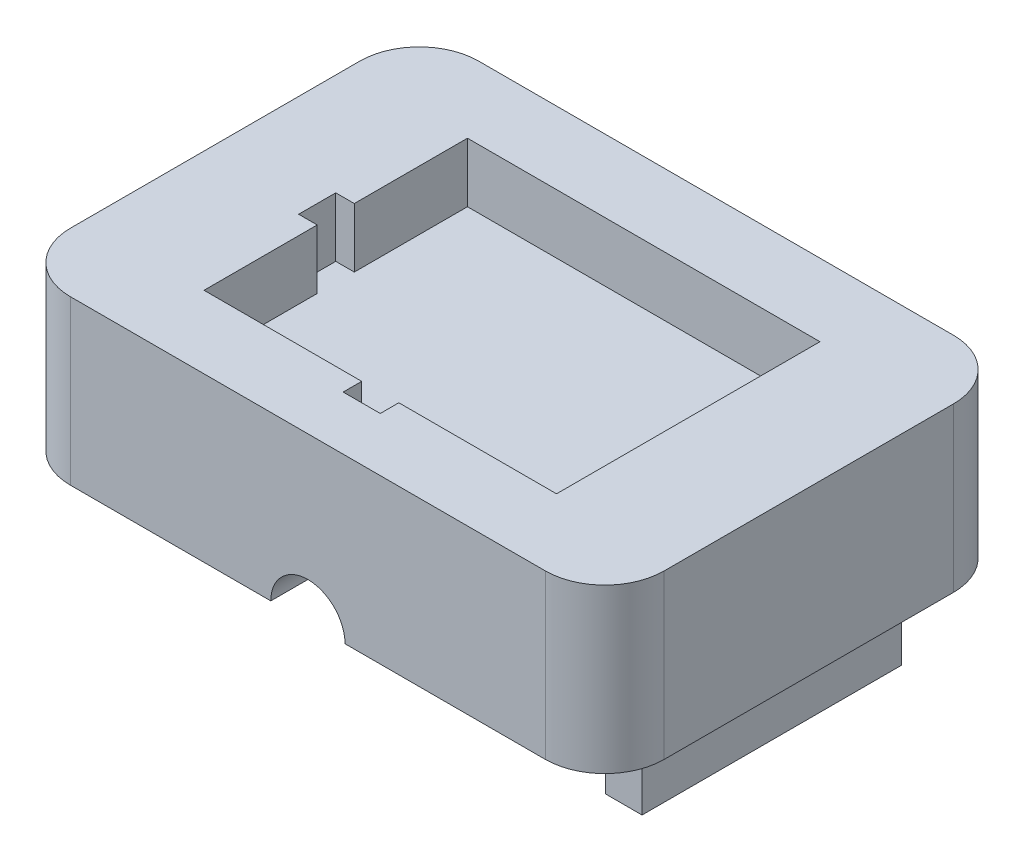
ISO-10303-21;
HEADER;
FILE_DESCRIPTION(('STEP AP214'),'2;1');
FILE_NAME('part.step','',(''),(''),'','','');
FILE_SCHEMA(('AUTOMOTIVE_DESIGN { 1 0 10303 214 1 1 1 1 }'));
ENDSEC;
DATA;
#1=APPLICATION_CONTEXT('core data for automotive mechanical design processes');
#2=APPLICATION_PROTOCOL_DEFINITION('international standard','automotive_design',2000,#1);
#3=PRODUCT_CONTEXT('',#1,'mechanical');
#4=PRODUCT('Part','Part','',(#3));
#5=PRODUCT_RELATED_PRODUCT_CATEGORY('part','',(#4));
#6=PRODUCT_DEFINITION_FORMATION('','',#4);
#7=PRODUCT_DEFINITION_CONTEXT('part definition',#1,'design');
#8=PRODUCT_DEFINITION('design','',#6,#7);
#9=PRODUCT_DEFINITION_SHAPE('','',#8);
#10=(LENGTH_UNIT() NAMED_UNIT(*) SI_UNIT(.MILLI.,.METRE.));
#11=(NAMED_UNIT(*) PLANE_ANGLE_UNIT() SI_UNIT($,.RADIAN.));
#12=(NAMED_UNIT(*) SI_UNIT($,.STERADIAN.) SOLID_ANGLE_UNIT());
#13=UNCERTAINTY_MEASURE_WITH_UNIT(LENGTH_MEASURE(1.E-05),#10,'distance_accuracy_value','');
#14=(GEOMETRIC_REPRESENTATION_CONTEXT(3) GLOBAL_UNCERTAINTY_ASSIGNED_CONTEXT((#13)) GLOBAL_UNIT_ASSIGNED_CONTEXT((#10,
#11,#12)) REPRESENTATION_CONTEXT('',''));
#15=CARTESIAN_POINT('',(0.,0.,0.));
#16=DIRECTION('',(0.,0.,1.));
#17=DIRECTION('',(1.,0.,0.));
#18=AXIS2_PLACEMENT_3D('',#15,#16,#17);
#19=CARTESIAN_POINT('',(0.,0.,55.));
#20=DIRECTION('',(0.,-1.,0.));
#21=DIRECTION('',(1.,0.,0.));
#22=AXIS2_PLACEMENT_3D('',#19,#20,#21);
#23=PLANE('',#22);
#24=DIRECTION('',(-1.,0.,0.));
#25=VECTOR('',#24,1.);
#26=CARTESIAN_POINT('',(0.,0.,0.));
#27=LINE('',#26,#25);
#28=CARTESIAN_POINT('',(32.,0.,0.));
#29=VERTEX_POINT('',#28);
#30=CARTESIAN_POINT('',(5.,0.,0.));
#31=VERTEX_POINT('',#30);
#32=EDGE_CURVE('E530',#29,#31,#27,.T.);
#33=ORIENTED_EDGE('',*,*,#32,.F.);
#34=CARTESIAN_POINT('',(32.,0.,8.));
#35=DIRECTION('',(0.,-1.,0.));
#36=DIRECTION('',(1.,0.,0.));
#37=AXIS2_PLACEMENT_3D('',#34,#35,#36);
#38=CIRCLE('',#37,8.);
#39=CARTESIAN_POINT('',(40.,0.,8.));
#40=VERTEX_POINT('',#39);
#41=EDGE_CURVE('E602',#29,#40,#38,.T.);
#42=ORIENTED_EDGE('',*,*,#41,.T.);
#43=DIRECTION('',(0.,0.,-1.));
#44=VECTOR('',#43,1.);
#45=CARTESIAN_POINT('',(40.,0.,55.));
#46=LINE('',#45,#44);
#47=CARTESIAN_POINT('',(40.,0.,47.));
#48=VERTEX_POINT('',#47);
#49=EDGE_CURVE('E554',#48,#40,#46,.T.);
#50=ORIENTED_EDGE('',*,*,#49,.F.);
#51=CARTESIAN_POINT('',(32.,0.,47.));
#52=DIRECTION('',(0.,-1.,0.));
#53=DIRECTION('',(1.,0.,0.));
#54=AXIS2_PLACEMENT_3D('',#51,#52,#53);
#55=CIRCLE('',#54,8.);
#56=CARTESIAN_POINT('',(32.,0.,55.));
#57=VERTEX_POINT('',#56);
#58=EDGE_CURVE('E599',#48,#57,#55,.T.);
#59=ORIENTED_EDGE('',*,*,#58,.T.);
#60=DIRECTION('',(-1.,0.,0.));
#61=VECTOR('',#60,1.);
#62=CARTESIAN_POINT('',(0.,0.,55.));
#63=LINE('',#62,#61);
#64=CARTESIAN_POINT('',(5.,0.,55.));
#65=VERTEX_POINT('',#64);
#66=EDGE_CURVE('E514',#57,#65,#63,.T.);
#67=ORIENTED_EDGE('',*,*,#66,.T.);
#68=DIRECTION('',(0.,0.,-1.));
#69=VECTOR('',#68,1.);
#70=CARTESIAN_POINT('',(5.,0.,55.));
#71=LINE('',#70,#69);
#72=CARTESIAN_POINT('',(5.,0.,30.525));
#73=VERTEX_POINT('',#72);
#74=EDGE_CURVE('E559',#65,#73,#71,.T.);
#75=ORIENTED_EDGE('',*,*,#74,.T.);
#76=DIRECTION('',(-1.,0.,0.));
#77=VECTOR('',#76,1.);
#78=CARTESIAN_POINT('',(0.,0.,30.525));
#79=LINE('',#78,#77);
#80=CARTESIAN_POINT('',(9.525,0.,30.525));
#81=VERTEX_POINT('',#80);
#82=EDGE_CURVE('E495',#81,#73,#79,.T.);
#83=ORIENTED_EDGE('',*,*,#82,.F.);
#84=DIRECTION('',(0.,0.,1.));
#85=VECTOR('',#84,1.);
#86=CARTESIAN_POINT('',(9.525,0.,24.475));
#87=LINE('',#86,#85);
#88=CARTESIAN_POINT('',(9.525,0.,24.475));
#89=VERTEX_POINT('',#88);
#90=EDGE_CURVE('E506',#89,#81,#87,.T.);
#91=ORIENTED_EDGE('',*,*,#90,.F.);
#92=DIRECTION('',(-1.,0.,0.));
#93=VECTOR('',#92,1.);
#94=CARTESIAN_POINT('',(0.,0.,24.475));
#95=LINE('',#94,#93);
#96=CARTESIAN_POINT('',(5.,0.,24.475));
#97=VERTEX_POINT('',#96);
#98=EDGE_CURVE('E502',#89,#97,#95,.T.);
#99=ORIENTED_EDGE('',*,*,#98,.T.);
#100=EDGE_CURVE('E558',#97,#31,#71,.T.);
#101=ORIENTED_EDGE('',*,*,#100,.T.);
#102=EDGE_LOOP('',(#33,#42,#50,#59,#67,#75,#83,#91,#99,#101));
#103=FACE_BOUND('',#102,.T.);
#104=DIRECTION('',(-1.,0.,0.));
#105=VECTOR('',#104,1.);
#106=CARTESIAN_POINT('',(30.05,0.,44.975));
#107=LINE('',#106,#105);
#108=CARTESIAN_POINT('',(35.,0.,44.975));
#109=VERTEX_POINT('',#108);
#110=CARTESIAN_POINT('',(30.05,0.,44.975));
#111=VERTEX_POINT('',#110);
#112=EDGE_CURVE('E421',#109,#111,#107,.T.);
#113=ORIENTED_EDGE('',*,*,#112,.F.);
#114=DIRECTION('',(0.,0.,1.));
#115=VECTOR('',#114,1.);
#116=CARTESIAN_POINT('',(35.,0.,10.025));
#117=LINE('',#116,#115);
#118=CARTESIAN_POINT('',(35.,0.,10.025));
#119=VERTEX_POINT('',#118);
#120=EDGE_CURVE('E373',#119,#109,#117,.T.);
#121=ORIENTED_EDGE('',*,*,#120,.F.);
#122=DIRECTION('',(1.,0.,0.));
#123=VECTOR('',#122,1.);
#124=CARTESIAN_POINT('',(30.05,0.,10.025));
#125=LINE('',#124,#123);
#126=CARTESIAN_POINT('',(30.05,0.,10.025));
#127=VERTEX_POINT('',#126);
#128=EDGE_CURVE('E408',#127,#119,#125,.T.);
#129=ORIENTED_EDGE('',*,*,#128,.F.);
#130=DIRECTION('',(0.,0.,-1.));
#131=VECTOR('',#130,1.);
#132=CARTESIAN_POINT('',(30.05,0.,10.025));
#133=LINE('',#132,#131);
#134=EDGE_CURVE('E424',#111,#127,#133,.T.);
#135=ORIENTED_EDGE('',*,*,#134,.F.);
#136=EDGE_LOOP('',(#113,#121,#129,#135));
#137=FACE_BOUND('',#136,.T.);
#138=ADVANCED_FACE('F41',(#103,#137),#23,.T.);
#139=CARTESIAN_POINT('',(0.,0.,55.));
#140=DIRECTION('',(0.,-1.,0.));
#141=DIRECTION('',(1.,0.,0.));
#142=AXIS2_PLACEMENT_3D('',#139,#140,#141);
#143=PLANE('',#142);
#144=DIRECTION('',(-1.,0.,0.));
#145=VECTOR('',#144,1.);
#146=CARTESIAN_POINT('',(0.,0.,55.));
#147=LINE('',#146,#145);
#148=CARTESIAN_POINT('',(-5.,0.,55.));
#149=VERTEX_POINT('',#148);
#150=CARTESIAN_POINT('',(-32.,0.,55.));
#151=VERTEX_POINT('',#150);
#152=EDGE_CURVE('E522',#149,#151,#147,.T.);
#153=ORIENTED_EDGE('',*,*,#152,.T.);
#154=CARTESIAN_POINT('',(-32.,0.,47.));
#155=DIRECTION('',(0.,-1.,0.));
#156=DIRECTION('',(1.,0.,0.));
#157=AXIS2_PLACEMENT_3D('',#154,#155,#156);
#158=CIRCLE('',#157,8.);
#159=CARTESIAN_POINT('',(-40.,0.,47.));
#160=VERTEX_POINT('',#159);
#161=EDGE_CURVE('E11',#151,#160,#158,.T.);
#162=ORIENTED_EDGE('',*,*,#161,.T.);
#163=DIRECTION('',(0.,0.,-1.));
#164=VECTOR('',#163,1.);
#165=CARTESIAN_POINT('',(-40.,0.,55.));
#166=LINE('',#165,#164);
#167=CARTESIAN_POINT('',(-40.,0.,8.));
#168=VERTEX_POINT('',#167);
#169=EDGE_CURVE('E544',#160,#168,#166,.T.);
#170=ORIENTED_EDGE('',*,*,#169,.T.);
#171=CARTESIAN_POINT('',(-32.,0.,8.));
#172=DIRECTION('',(0.,-1.,0.));
#173=DIRECTION('',(1.,0.,0.));
#174=AXIS2_PLACEMENT_3D('',#171,#172,#173);
#175=CIRCLE('',#174,8.);
#176=CARTESIAN_POINT('',(-32.,0.,0.));
#177=VERTEX_POINT('',#176);
#178=EDGE_CURVE('E50',#168,#177,#175,.T.);
#179=ORIENTED_EDGE('',*,*,#178,.T.);
#180=DIRECTION('',(-1.,0.,0.));
#181=VECTOR('',#180,1.);
#182=CARTESIAN_POINT('',(0.,0.,0.));
#183=LINE('',#182,#181);
#184=CARTESIAN_POINT('',(-5.,0.,0.));
#185=VERTEX_POINT('',#184);
#186=EDGE_CURVE('E515',#185,#177,#183,.T.);
#187=ORIENTED_EDGE('',*,*,#186,.F.);
#188=DIRECTION('',(0.,0.,-1.));
#189=VECTOR('',#188,1.);
#190=CARTESIAN_POINT('',(-5.,0.,55.));
#191=LINE('',#190,#189);
#192=CARTESIAN_POINT('',(-5.,0.,24.475));
#193=VERTEX_POINT('',#192);
#194=EDGE_CURVE('E526',#193,#185,#191,.T.);
#195=ORIENTED_EDGE('',*,*,#194,.F.);
#196=DIRECTION('',(-1.,0.,0.));
#197=VECTOR('',#196,1.);
#198=CARTESIAN_POINT('',(0.,0.,24.475));
#199=LINE('',#198,#197);
#200=CARTESIAN_POINT('',(-9.525,0.,24.475));
#201=VERTEX_POINT('',#200);
#202=EDGE_CURVE('E569',#193,#201,#199,.T.);
#203=ORIENTED_EDGE('',*,*,#202,.T.);
#204=DIRECTION('',(0.,0.,1.));
#205=VECTOR('',#204,1.);
#206=CARTESIAN_POINT('',(-9.525,0.,24.475));
#207=LINE('',#206,#205);
#208=CARTESIAN_POINT('',(-9.525,0.,30.525));
#209=VERTEX_POINT('',#208);
#210=EDGE_CURVE('E566',#209,#201,#207,.F.);
#211=ORIENTED_EDGE('',*,*,#210,.F.);
#212=DIRECTION('',(-1.,0.,0.));
#213=VECTOR('',#212,1.);
#214=CARTESIAN_POINT('',(0.,0.,30.525));
#215=LINE('',#214,#213);
#216=CARTESIAN_POINT('',(-5.,0.,30.525));
#217=VERTEX_POINT('',#216);
#218=EDGE_CURVE('E563',#217,#209,#215,.T.);
#219=ORIENTED_EDGE('',*,*,#218,.F.);
#220=EDGE_CURVE('E540',#149,#217,#191,.T.);
#221=ORIENTED_EDGE('',*,*,#220,.F.);
#222=EDGE_LOOP('',(#153,#162,#170,#179,#187,#195,#203,#211,#219,#221));
#223=FACE_BOUND('',#222,.T.);
#224=DIRECTION('',(1.,0.,0.));
#225=VECTOR('',#224,1.);
#226=CARTESIAN_POINT('',(-35.,0.,10.025));
#227=LINE('',#226,#225);
#228=CARTESIAN_POINT('',(-35.,0.,10.025));
#229=VERTEX_POINT('',#228);
#230=CARTESIAN_POINT('',(-30.05,0.,10.025));
#231=VERTEX_POINT('',#230);
#232=EDGE_CURVE('E462',#229,#231,#227,.T.);
#233=ORIENTED_EDGE('',*,*,#232,.F.);
#234=DIRECTION('',(0.,0.,-1.));
#235=VECTOR('',#234,1.);
#236=CARTESIAN_POINT('',(-35.,0.,44.975));
#237=LINE('',#236,#235);
#238=CARTESIAN_POINT('',(-35.,0.,44.975));
#239=VERTEX_POINT('',#238);
#240=EDGE_CURVE('E443',#239,#229,#237,.T.);
#241=ORIENTED_EDGE('',*,*,#240,.F.);
#242=DIRECTION('',(-1.,0.,0.));
#243=VECTOR('',#242,1.);
#244=CARTESIAN_POINT('',(-35.,0.,44.975));
#245=LINE('',#244,#243);
#246=CARTESIAN_POINT('',(-30.05,0.,44.975));
#247=VERTEX_POINT('',#246);
#248=EDGE_CURVE('E449',#247,#239,#245,.T.);
#249=ORIENTED_EDGE('',*,*,#248,.F.);
#250=DIRECTION('',(0.,0.,1.));
#251=VECTOR('',#250,1.);
#252=CARTESIAN_POINT('',(-30.05,0.,44.975));
#253=LINE('',#252,#251);
#254=EDGE_CURVE('E465',#231,#247,#253,.T.);
#255=ORIENTED_EDGE('',*,*,#254,.F.);
#256=EDGE_LOOP('',(#233,#241,#249,#255));
#257=FACE_BOUND('',#256,.T.);
#258=ADVANCED_FACE('F621',(#223,#257),#143,.T.);
#259=CARTESIAN_POINT('',(0.,0.,55.));
#260=DIRECTION('',(0.,0.,-1.));
#261=DIRECTION('',(-1.,0.,0.));
#262=AXIS2_PLACEMENT_3D('',#259,#260,#261);
#263=CYLINDRICAL_SURFACE('',#262,5.);
#264=ORIENTED_EDGE('',*,*,#100,.F.);
#265=CARTESIAN_POINT('',(0.,0.,24.475));
#266=DIRECTION('',(0.,0.,1.));
#267=DIRECTION('',(1.,0.,0.));
#268=AXIS2_PLACEMENT_3D('',#265,#266,#267);
#269=CIRCLE('',#268,5.);
#270=EDGE_CURVE('E498',#97,#193,#269,.T.);
#271=ORIENTED_EDGE('',*,*,#270,.T.);
#272=ORIENTED_EDGE('',*,*,#194,.T.);
#273=CARTESIAN_POINT('',(0.,0.,0.));
#274=DIRECTION('',(0.,0.,1.));
#275=DIRECTION('',(1.,0.,0.));
#276=AXIS2_PLACEMENT_3D('',#273,#274,#275);
#277=CIRCLE('',#276,5.);
#278=EDGE_CURVE('E509',#31,#185,#277,.T.);
#279=ORIENTED_EDGE('',*,*,#278,.F.);
#280=EDGE_LOOP('',(#264,#271,#272,#279));
#281=FACE_BOUND('',#280,.T.);
#282=ADVANCED_FACE('F667',(#281),#263,.F.);
#283=CARTESIAN_POINT('',(0.,0.,30.525));
#284=DIRECTION('',(0.,0.,1.));
#285=DIRECTION('',(1.,0.,0.));
#286=AXIS2_PLACEMENT_3D('',#283,#284,#285);
#287=CIRCLE('',#286,5.);
#288=EDGE_CURVE('E489',#73,#217,#287,.T.);
#289=ORIENTED_EDGE('',*,*,#288,.F.);
#290=ORIENTED_EDGE('',*,*,#74,.F.);
#291=CARTESIAN_POINT('',(0.,0.,55.));
#292=DIRECTION('',(0.,0.,1.));
#293=DIRECTION('',(1.,0.,0.));
#294=AXIS2_PLACEMENT_3D('',#291,#292,#293);
#295=CIRCLE('',#294,5.);
#296=EDGE_CURVE('E510',#65,#149,#295,.T.);
#297=ORIENTED_EDGE('',*,*,#296,.T.);
#298=ORIENTED_EDGE('',*,*,#220,.T.);
#299=EDGE_LOOP('',(#289,#290,#297,#298));
#300=FACE_BOUND('',#299,.T.);
#301=ADVANCED_FACE('F683',(#300),#263,.F.);
#302=CARTESIAN_POINT('',(40.,0.,55.));
#303=DIRECTION('',(-1.,0.,0.));
#304=DIRECTION('',(0.,0.,1.));
#305=AXIS2_PLACEMENT_3D('',#302,#303,#304);
#306=PLANE('',#305);
#307=ORIENTED_EDGE('',*,*,#49,.T.);
#308=DIRECTION('',(0.,1.,0.));
#309=VECTOR('',#308,1.);
#310=CARTESIAN_POINT('',(40.,0.,8.));
#311=LINE('',#310,#309);
#312=CARTESIAN_POINT('',(40.,22.,8.));
#313=VERTEX_POINT('',#312);
#314=EDGE_CURVE('E576',#40,#313,#311,.T.);
#315=ORIENTED_EDGE('',*,*,#314,.T.);
#316=DIRECTION('',(0.,0.,-1.));
#317=VECTOR('',#316,1.);
#318=CARTESIAN_POINT('',(40.,22.,55.));
#319=LINE('',#318,#317);
#320=CARTESIAN_POINT('',(40.,22.,47.));
#321=VERTEX_POINT('',#320);
#322=EDGE_CURVE('E550',#321,#313,#319,.T.);
#323=ORIENTED_EDGE('',*,*,#322,.F.);
#324=DIRECTION('',(0.,1.,0.));
#325=VECTOR('',#324,1.);
#326=CARTESIAN_POINT('',(40.,0.,47.));
#327=LINE('',#326,#325);
#328=EDGE_CURVE('E573',#321,#48,#327,.F.);
#329=ORIENTED_EDGE('',*,*,#328,.T.);
#330=EDGE_LOOP('',(#307,#315,#323,#329));
#331=FACE_BOUND('',#330,.T.);
#332=ADVANCED_FACE('F652',(#331),#306,.F.);
#333=CARTESIAN_POINT('',(0.,22.,55.));
#334=DIRECTION('',(0.,-1.,0.));
#335=DIRECTION('',(1.,0.,0.));
#336=AXIS2_PLACEMENT_3D('',#333,#334,#335);
#337=PLANE('',#336);
#338=DIRECTION('',(-1.,0.,0.));
#339=VECTOR('',#338,1.);
#340=CARTESIAN_POINT('',(-23.75,22.,9.75000000000001));
#341=LINE('',#340,#339);
#342=CARTESIAN_POINT('',(23.75,22.,9.75));
#343=VERTEX_POINT('',#342);
#344=CARTESIAN_POINT('',(-23.75,22.,9.75000000000001));
#345=VERTEX_POINT('',#344);
#346=EDGE_CURVE('E332',#343,#345,#341,.T.);
#347=ORIENTED_EDGE('',*,*,#346,.F.);
#348=DIRECTION('',(0.,0.,-1.));
#349=VECTOR('',#348,1.);
#350=CARTESIAN_POINT('',(23.75,22.,45.25));
#351=LINE('',#350,#349);
#352=CARTESIAN_POINT('',(23.75,22.,45.25));
#353=VERTEX_POINT('',#352);
#354=EDGE_CURVE('E57',#353,#343,#351,.T.);
#355=ORIENTED_EDGE('',*,*,#354,.F.);
#356=DIRECTION('',(1.,0.,0.));
#357=VECTOR('',#356,1.);
#358=CARTESIAN_POINT('',(2.5,22.,45.25));
#359=LINE('',#358,#357);
#360=CARTESIAN_POINT('',(2.5,22.,45.25));
#361=VERTEX_POINT('',#360);
#362=EDGE_CURVE('E288',#361,#353,#359,.T.);
#363=ORIENTED_EDGE('',*,*,#362,.F.);
#364=DIRECTION('',(0.,0.,-1.));
#365=VECTOR('',#364,1.);
#366=CARTESIAN_POINT('',(2.5,22.,47.75));
#367=LINE('',#366,#365);
#368=CARTESIAN_POINT('',(2.5,22.,47.75));
#369=VERTEX_POINT('',#368);
#370=EDGE_CURVE('E292',#369,#361,#367,.T.);
#371=ORIENTED_EDGE('',*,*,#370,.F.);
#372=DIRECTION('',(1.,0.,0.));
#373=VECTOR('',#372,1.);
#374=CARTESIAN_POINT('',(-2.5,22.,47.75));
#375=LINE('',#374,#373);
#376=CARTESIAN_POINT('',(-2.5,22.,47.75));
#377=VERTEX_POINT('',#376);
#378=EDGE_CURVE('E363',#377,#369,#375,.T.);
#379=ORIENTED_EDGE('',*,*,#378,.F.);
#380=DIRECTION('',(0.,0.,1.));
#381=VECTOR('',#380,1.);
#382=CARTESIAN_POINT('',(-2.5,22.,45.25));
#383=LINE('',#382,#381);
#384=CARTESIAN_POINT('',(-2.5,22.,45.25));
#385=VERTEX_POINT('',#384);
#386=EDGE_CURVE('E359',#385,#377,#383,.T.);
#387=ORIENTED_EDGE('',*,*,#386,.F.);
#388=DIRECTION('',(1.,0.,0.));
#389=VECTOR('',#388,1.);
#390=CARTESIAN_POINT('',(-23.75,22.,45.25));
#391=LINE('',#390,#389);
#392=CARTESIAN_POINT('',(-23.75,22.,45.25));
#393=VERTEX_POINT('',#392);
#394=EDGE_CURVE('E355',#393,#385,#391,.T.);
#395=ORIENTED_EDGE('',*,*,#394,.F.);
#396=DIRECTION('',(0.,0.,1.));
#397=VECTOR('',#396,1.);
#398=CARTESIAN_POINT('',(-23.75,22.,45.25));
#399=LINE('',#398,#397);
#400=CARTESIAN_POINT('',(-23.75,22.,30.));
#401=VERTEX_POINT('',#400);
#402=EDGE_CURVE('E351',#401,#393,#399,.T.);
#403=ORIENTED_EDGE('',*,*,#402,.F.);
#404=DIRECTION('',(1.,0.,0.));
#405=VECTOR('',#404,1.);
#406=CARTESIAN_POINT('',(-26.25,22.,30.));
#407=LINE('',#406,#405);
#408=CARTESIAN_POINT('',(-26.25,22.,30.));
#409=VERTEX_POINT('',#408);
#410=EDGE_CURVE('E347',#409,#401,#407,.T.);
#411=ORIENTED_EDGE('',*,*,#410,.F.);
#412=DIRECTION('',(0.,0.,1.));
#413=VECTOR('',#412,1.);
#414=CARTESIAN_POINT('',(-26.25,22.,25.));
#415=LINE('',#414,#413);
#416=CARTESIAN_POINT('',(-26.25,22.,25.));
#417=VERTEX_POINT('',#416);
#418=EDGE_CURVE('E343',#417,#409,#415,.T.);
#419=ORIENTED_EDGE('',*,*,#418,.F.);
#420=DIRECTION('',(-1.,0.,0.));
#421=VECTOR('',#420,1.);
#422=CARTESIAN_POINT('',(-23.75,22.,25.));
#423=LINE('',#422,#421);
#424=CARTESIAN_POINT('',(-23.75,22.,25.));
#425=VERTEX_POINT('',#424);
#426=EDGE_CURVE('E339',#425,#417,#423,.T.);
#427=ORIENTED_EDGE('',*,*,#426,.F.);
#428=DIRECTION('',(0.,0.,1.));
#429=VECTOR('',#428,1.);
#430=CARTESIAN_POINT('',(-23.75,22.,25.));
#431=LINE('',#430,#429);
#432=EDGE_CURVE('E335',#345,#425,#431,.T.);
#433=ORIENTED_EDGE('',*,*,#432,.F.);
#434=EDGE_LOOP('',(#347,#355,#363,#371,#379,#387,#395,#403,#411,#419,#427,#433));
#435=FACE_BOUND('',#434,.T.);
#436=ORIENTED_EDGE('',*,*,#322,.T.);
#437=CARTESIAN_POINT('',(32.,22.,8.));
#438=DIRECTION('',(0.,-1.,0.));
#439=DIRECTION('',(1.,0.,0.));
#440=AXIS2_PLACEMENT_3D('',#437,#438,#439);
#441=CIRCLE('',#440,8.);
#442=CARTESIAN_POINT('',(32.,22.,0.));
#443=VERTEX_POINT('',#442);
#444=EDGE_CURVE('E589',#313,#443,#441,.F.);
#445=ORIENTED_EDGE('',*,*,#444,.T.);
#446=DIRECTION('',(-1.,0.,0.));
#447=VECTOR('',#446,1.);
#448=CARTESIAN_POINT('',(0.,22.,0.));
#449=LINE('',#448,#447);
#450=CARTESIAN_POINT('',(-32.,22.,0.));
#451=VERTEX_POINT('',#450);
#452=EDGE_CURVE('E533',#443,#451,#449,.T.);
#453=ORIENTED_EDGE('',*,*,#452,.T.);
#454=CARTESIAN_POINT('',(-32.,22.,8.));
#455=DIRECTION('',(0.,-1.,0.));
#456=DIRECTION('',(1.,0.,0.));
#457=AXIS2_PLACEMENT_3D('',#454,#455,#456);
#458=CIRCLE('',#457,8.);
#459=CARTESIAN_POINT('',(-40.,22.,8.));
#460=VERTEX_POINT('',#459);
#461=EDGE_CURVE('E580',#451,#460,#458,.F.);
#462=ORIENTED_EDGE('',*,*,#461,.T.);
#463=DIRECTION('',(0.,0.,-1.));
#464=VECTOR('',#463,1.);
#465=CARTESIAN_POINT('',(-40.,22.,55.));
#466=LINE('',#465,#464);
#467=CARTESIAN_POINT('',(-40.,22.,47.));
#468=VERTEX_POINT('',#467);
#469=EDGE_CURVE('E547',#468,#460,#466,.T.);
#470=ORIENTED_EDGE('',*,*,#469,.F.);
#471=CARTESIAN_POINT('',(-32.,22.,47.));
#472=DIRECTION('',(0.,-1.,0.));
#473=DIRECTION('',(1.,0.,0.));
#474=AXIS2_PLACEMENT_3D('',#471,#472,#473);
#475=CIRCLE('',#474,8.);
#476=CARTESIAN_POINT('',(-32.,22.,55.));
#477=VERTEX_POINT('',#476);
#478=EDGE_CURVE('E583',#468,#477,#475,.F.);
#479=ORIENTED_EDGE('',*,*,#478,.T.);
#480=DIRECTION('',(-1.,0.,0.));
#481=VECTOR('',#480,1.);
#482=CARTESIAN_POINT('',(0.,22.,55.));
#483=LINE('',#482,#481);
#484=CARTESIAN_POINT('',(32.,22.,55.));
#485=VERTEX_POINT('',#484);
#486=EDGE_CURVE('E518',#485,#477,#483,.T.);
#487=ORIENTED_EDGE('',*,*,#486,.F.);
#488=CARTESIAN_POINT('',(32.,22.,47.));
#489=DIRECTION('',(0.,-1.,0.));
#490=DIRECTION('',(1.,0.,0.));
#491=AXIS2_PLACEMENT_3D('',#488,#489,#490);
#492=CIRCLE('',#491,8.);
#493=EDGE_CURVE('E586',#485,#321,#492,.F.);
#494=ORIENTED_EDGE('',*,*,#493,.T.);
#495=EDGE_LOOP('',(#436,#445,#453,#462,#470,#479,#487,#494));
#496=FACE_BOUND('',#495,.T.);
#497=ADVANCED_FACE('F632',(#435,#496),#337,.F.);
#498=CARTESIAN_POINT('',(-40.,0.,55.));
#499=DIRECTION('',(-1.,0.,0.));
#500=DIRECTION('',(0.,-1.,0.));
#501=AXIS2_PLACEMENT_3D('',#498,#499,#500);
#502=PLANE('',#501);
#503=ORIENTED_EDGE('',*,*,#169,.F.);
#504=DIRECTION('',(0.,1.,0.));
#505=VECTOR('',#504,1.);
#506=CARTESIAN_POINT('',(-40.,0.,47.));
#507=LINE('',#506,#505);
#508=EDGE_CURVE('E614',#160,#468,#507,.T.);
#509=ORIENTED_EDGE('',*,*,#508,.T.);
#510=ORIENTED_EDGE('',*,*,#469,.T.);
#511=DIRECTION('',(0.,1.,0.));
#512=VECTOR('',#511,1.);
#513=CARTESIAN_POINT('',(-40.,0.,8.));
#514=LINE('',#513,#512);
#515=EDGE_CURVE('E65',#460,#168,#514,.F.);
#516=ORIENTED_EDGE('',*,*,#515,.T.);
#517=EDGE_LOOP('',(#503,#509,#510,#516));
#518=FACE_BOUND('',#517,.T.);
#519=ADVANCED_FACE('F633',(#518),#502,.T.);
#520=CARTESIAN_POINT('',(0.,0.,55.));
#521=DIRECTION('',(0.,0.,1.));
#522=DIRECTION('',(1.,0.,0.));
#523=AXIS2_PLACEMENT_3D('',#520,#521,#522);
#524=PLANE('',#523);
#525=ORIENTED_EDGE('',*,*,#66,.F.);
#526=DIRECTION('',(0.,1.,0.));
#527=VECTOR('',#526,1.);
#528=CARTESIAN_POINT('',(32.,22.,55.));
#529=LINE('',#528,#527);
#530=EDGE_CURVE('E608',#57,#485,#529,.T.);
#531=ORIENTED_EDGE('',*,*,#530,.T.);
#532=ORIENTED_EDGE('',*,*,#486,.T.);
#533=DIRECTION('',(0.,1.,0.));
#534=VECTOR('',#533,1.);
#535=CARTESIAN_POINT('',(-32.,0.,55.));
#536=LINE('',#535,#534);
#537=EDGE_CURVE('E605',#477,#151,#536,.F.);
#538=ORIENTED_EDGE('',*,*,#537,.T.);
#539=ORIENTED_EDGE('',*,*,#152,.F.);
#540=ORIENTED_EDGE('',*,*,#296,.F.);
#541=EDGE_LOOP('',(#525,#531,#532,#538,#539,#540));
#542=FACE_BOUND('',#541,.T.);
#543=ADVANCED_FACE('F642',(#542),#524,.T.);
#544=CARTESIAN_POINT('',(0.,0.,0.));
#545=DIRECTION('',(0.,0.,1.));
#546=DIRECTION('',(1.,0.,0.));
#547=AXIS2_PLACEMENT_3D('',#544,#545,#546);
#548=PLANE('',#547);
#549=ORIENTED_EDGE('',*,*,#452,.F.);
#550=DIRECTION('',(0.,1.,0.));
#551=VECTOR('',#550,1.);
#552=CARTESIAN_POINT('',(32.,0.,0.));
#553=LINE('',#552,#551);
#554=EDGE_CURVE('E596',#443,#29,#553,.F.);
#555=ORIENTED_EDGE('',*,*,#554,.T.);
#556=ORIENTED_EDGE('',*,*,#32,.T.);
#557=ORIENTED_EDGE('',*,*,#278,.T.);
#558=ORIENTED_EDGE('',*,*,#186,.T.);
#559=DIRECTION('',(0.,1.,0.));
#560=VECTOR('',#559,1.);
#561=CARTESIAN_POINT('',(-32.,22.,0.));
#562=LINE('',#561,#560);
#563=EDGE_CURVE('E592',#177,#451,#562,.T.);
#564=ORIENTED_EDGE('',*,*,#563,.T.);
#565=EDGE_LOOP('',(#549,#555,#556,#557,#558,#564));
#566=FACE_BOUND('',#565,.T.);
#567=ADVANCED_FACE('F628',(#566),#548,.F.);
#568=CARTESIAN_POINT('',(0.,0.,24.475));
#569=DIRECTION('',(0.,0.,1.));
#570=DIRECTION('',(1.,0.,0.));
#571=AXIS2_PLACEMENT_3D('',#568,#569,#570);
#572=CYLINDRICAL_SURFACE('',#571,9.525);
#573=ORIENTED_EDGE('',*,*,#90,.T.);
#574=CARTESIAN_POINT('',(0.,0.,30.525));
#575=DIRECTION('',(0.,0.,1.));
#576=DIRECTION('',(1.,0.,0.));
#577=AXIS2_PLACEMENT_3D('',#574,#575,#576);
#578=CIRCLE('',#577,9.525);
#579=EDGE_CURVE('E484',#81,#209,#578,.T.);
#580=ORIENTED_EDGE('',*,*,#579,.T.);
#581=ORIENTED_EDGE('',*,*,#210,.T.);
#582=CARTESIAN_POINT('',(0.,0.,24.475));
#583=DIRECTION('',(0.,0.,1.));
#584=DIRECTION('',(1.,0.,0.));
#585=AXIS2_PLACEMENT_3D('',#582,#583,#584);
#586=CIRCLE('',#585,9.525);
#587=EDGE_CURVE('E485',#89,#201,#586,.T.);
#588=ORIENTED_EDGE('',*,*,#587,.F.);
#589=EDGE_LOOP('',(#573,#580,#581,#588));
#590=FACE_BOUND('',#589,.T.);
#591=ADVANCED_FACE('F675',(#590),#572,.F.);
#592=CARTESIAN_POINT('',(0.,0.,24.475));
#593=DIRECTION('',(0.,0.,1.));
#594=DIRECTION('',(1.,0.,0.));
#595=AXIS2_PLACEMENT_3D('',#592,#593,#594);
#596=PLANE('',#595);
#597=ORIENTED_EDGE('',*,*,#587,.T.);
#598=ORIENTED_EDGE('',*,*,#202,.F.);
#599=ORIENTED_EDGE('',*,*,#270,.F.);
#600=ORIENTED_EDGE('',*,*,#98,.F.);
#601=EDGE_LOOP('',(#597,#598,#599,#600));
#602=FACE_BOUND('',#601,.T.);
#603=ADVANCED_FACE('F672',(#602),#596,.T.);
#604=CARTESIAN_POINT('',(0.,0.,30.525));
#605=DIRECTION('',(0.,0.,1.));
#606=DIRECTION('',(1.,0.,0.));
#607=AXIS2_PLACEMENT_3D('',#604,#605,#606);
#608=PLANE('',#607);
#609=ORIENTED_EDGE('',*,*,#82,.T.);
#610=ORIENTED_EDGE('',*,*,#288,.T.);
#611=ORIENTED_EDGE('',*,*,#218,.T.);
#612=ORIENTED_EDGE('',*,*,#579,.F.);
#613=EDGE_LOOP('',(#609,#610,#611,#612));
#614=FACE_BOUND('',#613,.T.);
#615=ADVANCED_FACE('F681',(#614),#608,.F.);
#616=CARTESIAN_POINT('',(-35.,-10.,44.975));
#617=DIRECTION('',(1.,0.,0.));
#618=DIRECTION('',(0.,0.,-1.));
#619=AXIS2_PLACEMENT_3D('',#616,#617,#618);
#620=PLANE('',#619);
#621=ORIENTED_EDGE('',*,*,#240,.T.);
#622=DIRECTION('',(0.,1.,0.));
#623=VECTOR('',#622,1.);
#624=CARTESIAN_POINT('',(-35.,-10.,10.025));
#625=LINE('',#624,#623);
#626=CARTESIAN_POINT('',(-35.,-10.,10.025));
#627=VERTEX_POINT('',#626);
#628=EDGE_CURVE('E481',#627,#229,#625,.T.);
#629=ORIENTED_EDGE('',*,*,#628,.F.);
#630=DIRECTION('',(0.,0.,-1.));
#631=VECTOR('',#630,1.);
#632=CARTESIAN_POINT('',(-35.,-10.,44.975));
#633=LINE('',#632,#631);
#634=CARTESIAN_POINT('',(-35.,-10.,44.975));
#635=VERTEX_POINT('',#634);
#636=EDGE_CURVE('E444',#635,#627,#633,.T.);
#637=ORIENTED_EDGE('',*,*,#636,.F.);
#638=DIRECTION('',(0.,1.,0.));
#639=VECTOR('',#638,1.);
#640=CARTESIAN_POINT('',(-35.,-10.,44.975));
#641=LINE('',#640,#639);
#642=EDGE_CURVE('E458',#635,#239,#641,.T.);
#643=ORIENTED_EDGE('',*,*,#642,.T.);
#644=EDGE_LOOP('',(#621,#629,#637,#643));
#645=FACE_BOUND('',#644,.T.);
#646=ADVANCED_FACE('F712',(#645),#620,.F.);
#647=CARTESIAN_POINT('',(-35.,-10.,10.025));
#648=DIRECTION('',(0.,0.,1.));
#649=DIRECTION('',(1.,0.,0.));
#650=AXIS2_PLACEMENT_3D('',#647,#648,#649);
#651=PLANE('',#650);
#652=ORIENTED_EDGE('',*,*,#232,.T.);
#653=DIRECTION('',(0.,1.,0.));
#654=VECTOR('',#653,1.);
#655=CARTESIAN_POINT('',(-30.05,-10.,10.025));
#656=LINE('',#655,#654);
#657=CARTESIAN_POINT('',(-30.05,-10.,10.025));
#658=VERTEX_POINT('',#657);
#659=EDGE_CURVE('E477',#658,#231,#656,.T.);
#660=ORIENTED_EDGE('',*,*,#659,.F.);
#661=DIRECTION('',(1.,0.,0.));
#662=VECTOR('',#661,1.);
#663=CARTESIAN_POINT('',(-35.,-10.,10.025));
#664=LINE('',#663,#662);
#665=EDGE_CURVE('E448',#627,#658,#664,.T.);
#666=ORIENTED_EDGE('',*,*,#665,.F.);
#667=ORIENTED_EDGE('',*,*,#628,.T.);
#668=EDGE_LOOP('',(#652,#660,#666,#667));
#669=FACE_BOUND('',#668,.T.);
#670=ADVANCED_FACE('F717',(#669),#651,.F.);
#671=CARTESIAN_POINT('',(-30.05,-10.,44.975));
#672=DIRECTION('',(-1.,0.,0.));
#673=DIRECTION('',(0.,0.,1.));
#674=AXIS2_PLACEMENT_3D('',#671,#672,#673);
#675=PLANE('',#674);
#676=ORIENTED_EDGE('',*,*,#254,.T.);
#677=DIRECTION('',(0.,1.,0.));
#678=VECTOR('',#677,1.);
#679=CARTESIAN_POINT('',(-30.05,-10.,44.975));
#680=LINE('',#679,#678);
#681=CARTESIAN_POINT('',(-30.05,-10.,44.975));
#682=VERTEX_POINT('',#681);
#683=EDGE_CURVE('E474',#682,#247,#680,.T.);
#684=ORIENTED_EDGE('',*,*,#683,.F.);
#685=DIRECTION('',(0.,0.,1.));
#686=VECTOR('',#685,1.);
#687=CARTESIAN_POINT('',(-30.05,-10.,44.975));
#688=LINE('',#687,#686);
#689=EDGE_CURVE('E452',#658,#682,#688,.T.);
#690=ORIENTED_EDGE('',*,*,#689,.F.);
#691=ORIENTED_EDGE('',*,*,#659,.T.);
#692=EDGE_LOOP('',(#676,#684,#690,#691));
#693=FACE_BOUND('',#692,.T.);
#694=ADVANCED_FACE('F721',(#693),#675,.F.);
#695=CARTESIAN_POINT('',(-35.,-10.,44.975));
#696=DIRECTION('',(0.,0.,-1.));
#697=DIRECTION('',(-1.,0.,0.));
#698=AXIS2_PLACEMENT_3D('',#695,#696,#697);
#699=PLANE('',#698);
#700=ORIENTED_EDGE('',*,*,#248,.T.);
#701=ORIENTED_EDGE('',*,*,#642,.F.);
#702=DIRECTION('',(-1.,0.,0.));
#703=VECTOR('',#702,1.);
#704=CARTESIAN_POINT('',(-35.,-10.,44.975));
#705=LINE('',#704,#703);
#706=EDGE_CURVE('E455',#682,#635,#705,.T.);
#707=ORIENTED_EDGE('',*,*,#706,.F.);
#708=ORIENTED_EDGE('',*,*,#683,.T.);
#709=EDGE_LOOP('',(#700,#701,#707,#708));
#710=FACE_BOUND('',#709,.T.);
#711=ADVANCED_FACE('F725',(#710),#699,.F.);
#712=CARTESIAN_POINT('',(0.,-10.,0.));
#713=DIRECTION('',(0.,-1.,0.));
#714=DIRECTION('',(1.,0.,0.));
#715=AXIS2_PLACEMENT_3D('',#712,#713,#714);
#716=PLANE('',#715);
#717=ORIENTED_EDGE('',*,*,#636,.T.);
#718=ORIENTED_EDGE('',*,*,#665,.T.);
#719=ORIENTED_EDGE('',*,*,#689,.T.);
#720=ORIENTED_EDGE('',*,*,#706,.T.);
#721=EDGE_LOOP('',(#717,#718,#719,#720));
#722=FACE_BOUND('',#721,.T.);
#723=ADVANCED_FACE('F729',(#722),#716,.T.);
#724=CARTESIAN_POINT('',(35.,-10.,10.025));
#725=DIRECTION('',(-1.,0.,0.));
#726=DIRECTION('',(0.,-1.,0.));
#727=AXIS2_PLACEMENT_3D('',#724,#725,#726);
#728=PLANE('',#727);
#729=ORIENTED_EDGE('',*,*,#120,.T.);
#730=DIRECTION('',(0.,1.,0.));
#731=VECTOR('',#730,1.);
#732=CARTESIAN_POINT('',(35.,-10.,44.975));
#733=LINE('',#732,#731);
#734=CARTESIAN_POINT('',(35.,-10.,44.975));
#735=VERTEX_POINT('',#734);
#736=EDGE_CURVE('E440',#735,#109,#733,.T.);
#737=ORIENTED_EDGE('',*,*,#736,.F.);
#738=DIRECTION('',(0.,0.,1.));
#739=VECTOR('',#738,1.);
#740=CARTESIAN_POINT('',(35.,-10.,10.025));
#741=LINE('',#740,#739);
#742=CARTESIAN_POINT('',(35.,-10.,10.025));
#743=VERTEX_POINT('',#742);
#744=EDGE_CURVE('E403',#743,#735,#741,.T.);
#745=ORIENTED_EDGE('',*,*,#744,.F.);
#746=DIRECTION('',(0.,1.,0.));
#747=VECTOR('',#746,1.);
#748=CARTESIAN_POINT('',(35.,-10.,10.025));
#749=LINE('',#748,#747);
#750=EDGE_CURVE('E417',#743,#119,#749,.T.);
#751=ORIENTED_EDGE('',*,*,#750,.T.);
#752=EDGE_LOOP('',(#729,#737,#745,#751));
#753=FACE_BOUND('',#752,.T.);
#754=ADVANCED_FACE('F733',(#753),#728,.F.);
#755=CARTESIAN_POINT('',(30.05,-10.,44.975));
#756=DIRECTION('',(0.,0.,-1.));
#757=DIRECTION('',(-1.,0.,0.));
#758=AXIS2_PLACEMENT_3D('',#755,#756,#757);
#759=PLANE('',#758);
#760=ORIENTED_EDGE('',*,*,#112,.T.);
#761=DIRECTION('',(0.,1.,0.));
#762=VECTOR('',#761,1.);
#763=CARTESIAN_POINT('',(30.05,-10.,44.975));
#764=LINE('',#763,#762);
#765=CARTESIAN_POINT('',(30.05,-10.,44.975));
#766=VERTEX_POINT('',#765);
#767=EDGE_CURVE('E436',#766,#111,#764,.T.);
#768=ORIENTED_EDGE('',*,*,#767,.F.);
#769=DIRECTION('',(-1.,0.,0.));
#770=VECTOR('',#769,1.);
#771=CARTESIAN_POINT('',(30.05,-10.,44.975));
#772=LINE('',#771,#770);
#773=EDGE_CURVE('E407',#735,#766,#772,.T.);
#774=ORIENTED_EDGE('',*,*,#773,.F.);
#775=ORIENTED_EDGE('',*,*,#736,.T.);
#776=EDGE_LOOP('',(#760,#768,#774,#775));
#777=FACE_BOUND('',#776,.T.);
#778=ADVANCED_FACE('F737',(#777),#759,.F.);
#779=CARTESIAN_POINT('',(30.05,-10.,10.025));
#780=DIRECTION('',(1.,0.,0.));
#781=DIRECTION('',(0.,1.,0.));
#782=AXIS2_PLACEMENT_3D('',#779,#780,#781);
#783=PLANE('',#782);
#784=ORIENTED_EDGE('',*,*,#134,.T.);
#785=DIRECTION('',(0.,1.,0.));
#786=VECTOR('',#785,1.);
#787=CARTESIAN_POINT('',(30.05,-10.,10.025));
#788=LINE('',#787,#786);
#789=CARTESIAN_POINT('',(30.05,-10.,10.025));
#790=VERTEX_POINT('',#789);
#791=EDGE_CURVE('E433',#790,#127,#788,.T.);
#792=ORIENTED_EDGE('',*,*,#791,.F.);
#793=DIRECTION('',(0.,0.,-1.));
#794=VECTOR('',#793,1.);
#795=CARTESIAN_POINT('',(30.05,-10.,10.025));
#796=LINE('',#795,#794);
#797=EDGE_CURVE('E411',#766,#790,#796,.T.);
#798=ORIENTED_EDGE('',*,*,#797,.F.);
#799=ORIENTED_EDGE('',*,*,#767,.T.);
#800=EDGE_LOOP('',(#784,#792,#798,#799));
#801=FACE_BOUND('',#800,.T.);
#802=ADVANCED_FACE('F741',(#801),#783,.F.);
#803=CARTESIAN_POINT('',(30.05,-10.,10.025));
#804=DIRECTION('',(0.,0.,1.));
#805=DIRECTION('',(1.,0.,0.));
#806=AXIS2_PLACEMENT_3D('',#803,#804,#805);
#807=PLANE('',#806);
#808=ORIENTED_EDGE('',*,*,#128,.T.);
#809=ORIENTED_EDGE('',*,*,#750,.F.);
#810=DIRECTION('',(1.,0.,0.));
#811=VECTOR('',#810,1.);
#812=CARTESIAN_POINT('',(30.05,-10.,10.025));
#813=LINE('',#812,#811);
#814=EDGE_CURVE('E414',#790,#743,#813,.T.);
#815=ORIENTED_EDGE('',*,*,#814,.F.);
#816=ORIENTED_EDGE('',*,*,#791,.T.);
#817=EDGE_LOOP('',(#808,#809,#815,#816));
#818=FACE_BOUND('',#817,.T.);
#819=ADVANCED_FACE('F745',(#818),#807,.F.);
#820=CARTESIAN_POINT('',(0.,-10.,0.));
#821=DIRECTION('',(0.,1.,0.));
#822=DIRECTION('',(-1.,0.,0.));
#823=AXIS2_PLACEMENT_3D('',#820,#821,#822);
#824=PLANE('',#823);
#825=ORIENTED_EDGE('',*,*,#744,.T.);
#826=ORIENTED_EDGE('',*,*,#773,.T.);
#827=ORIENTED_EDGE('',*,*,#797,.T.);
#828=ORIENTED_EDGE('',*,*,#814,.T.);
#829=EDGE_LOOP('',(#825,#826,#827,#828));
#830=FACE_BOUND('',#829,.T.);
#831=ADVANCED_FACE('F749',(#830),#824,.F.);
#832=CARTESIAN_POINT('',(32.,0.,8.));
#833=DIRECTION('',(0.,1.,0.));
#834=DIRECTION('',(0.,0.,1.));
#835=AXIS2_PLACEMENT_3D('',#832,#833,#834);
#836=CYLINDRICAL_SURFACE('',#835,8.);
#837=ORIENTED_EDGE('',*,*,#41,.F.);
#838=ORIENTED_EDGE('',*,*,#554,.F.);
#839=ORIENTED_EDGE('',*,*,#444,.F.);
#840=ORIENTED_EDGE('',*,*,#314,.F.);
#841=EDGE_LOOP('',(#837,#838,#839,#840));
#842=FACE_BOUND('',#841,.T.);
#843=ADVANCED_FACE('F657',(#842),#836,.T.);
#844=CARTESIAN_POINT('',(32.,0.,47.));
#845=DIRECTION('',(0.,-1.,0.));
#846=DIRECTION('',(0.,0.,-1.));
#847=AXIS2_PLACEMENT_3D('',#844,#845,#846);
#848=CYLINDRICAL_SURFACE('',#847,8.);
#849=ORIENTED_EDGE('',*,*,#58,.F.);
#850=ORIENTED_EDGE('',*,*,#328,.F.);
#851=ORIENTED_EDGE('',*,*,#493,.F.);
#852=ORIENTED_EDGE('',*,*,#530,.F.);
#853=EDGE_LOOP('',(#849,#850,#851,#852));
#854=FACE_BOUND('',#853,.T.);
#855=ADVANCED_FACE('F648',(#854),#848,.T.);
#856=CARTESIAN_POINT('',(-32.,0.,47.));
#857=DIRECTION('',(0.,1.,0.));
#858=DIRECTION('',(-1.,0.,0.));
#859=AXIS2_PLACEMENT_3D('',#856,#857,#858);
#860=CYLINDRICAL_SURFACE('',#859,8.);
#861=ORIENTED_EDGE('',*,*,#161,.F.);
#862=ORIENTED_EDGE('',*,*,#537,.F.);
#863=ORIENTED_EDGE('',*,*,#478,.F.);
#864=ORIENTED_EDGE('',*,*,#508,.F.);
#865=EDGE_LOOP('',(#861,#862,#863,#864));
#866=FACE_BOUND('',#865,.T.);
#867=ADVANCED_FACE('F637',(#866),#860,.T.);
#868=CARTESIAN_POINT('',(-32.,0.,8.));
#869=DIRECTION('',(0.,-1.,0.));
#870=DIRECTION('',(1.,0.,0.));
#871=AXIS2_PLACEMENT_3D('',#868,#869,#870);
#872=CYLINDRICAL_SURFACE('',#871,8.);
#873=ORIENTED_EDGE('',*,*,#178,.F.);
#874=ORIENTED_EDGE('',*,*,#515,.F.);
#875=ORIENTED_EDGE('',*,*,#461,.F.);
#876=ORIENTED_EDGE('',*,*,#563,.F.);
#877=EDGE_LOOP('',(#873,#874,#875,#876));
#878=FACE_BOUND('',#877,.T.);
#879=ADVANCED_FACE('F43',(#878),#872,.T.);
#880=CARTESIAN_POINT('',(23.75,14.,45.25));
#881=DIRECTION('',(1.,0.,0.));
#882=DIRECTION('',(0.,1.,0.));
#883=AXIS2_PLACEMENT_3D('',#880,#881,#882);
#884=PLANE('',#883);
#885=ORIENTED_EDGE('',*,*,#354,.T.);
#886=DIRECTION('',(0.,1.,0.));
#887=VECTOR('',#886,1.);
#888=CARTESIAN_POINT('',(23.75,14.,9.75000000000001));
#889=LINE('',#888,#887);
#890=CARTESIAN_POINT('',(23.75,14.,9.75000000000001));
#891=VERTEX_POINT('',#890);
#892=EDGE_CURVE('E262',#891,#343,#889,.T.);
#893=ORIENTED_EDGE('',*,*,#892,.F.);
#894=DIRECTION('',(0.,0.,-1.));
#895=VECTOR('',#894,1.);
#896=CARTESIAN_POINT('',(23.75,14.,45.25));
#897=LINE('',#896,#895);
#898=CARTESIAN_POINT('',(23.75,14.,45.25));
#899=VERTEX_POINT('',#898);
#900=EDGE_CURVE('E266',#899,#891,#897,.T.);
#901=ORIENTED_EDGE('',*,*,#900,.F.);
#902=DIRECTION('',(0.,1.,0.));
#903=VECTOR('',#902,1.);
#904=CARTESIAN_POINT('',(23.75,14.,45.25));
#905=LINE('',#904,#903);
#906=EDGE_CURVE('E370',#899,#353,#905,.T.);
#907=ORIENTED_EDGE('',*,*,#906,.T.);
#908=EDGE_LOOP('',(#885,#893,#901,#907));
#909=FACE_BOUND('',#908,.T.);
#910=ADVANCED_FACE('F264',(#909),#884,.F.);
#911=CARTESIAN_POINT('',(2.5,14.,45.25));
#912=DIRECTION('',(0.,0.,1.));
#913=DIRECTION('',(1.,0.,0.));
#914=AXIS2_PLACEMENT_3D('',#911,#912,#913);
#915=PLANE('',#914);
#916=ORIENTED_EDGE('',*,*,#362,.T.);
#917=ORIENTED_EDGE('',*,*,#906,.F.);
#918=DIRECTION('',(1.,0.,0.));
#919=VECTOR('',#918,1.);
#920=CARTESIAN_POINT('',(2.5,14.,45.25));
#921=LINE('',#920,#919);
#922=CARTESIAN_POINT('',(2.5,14.,45.25));
#923=VERTEX_POINT('',#922);
#924=EDGE_CURVE('E273',#923,#899,#921,.T.);
#925=ORIENTED_EDGE('',*,*,#924,.F.);
#926=DIRECTION('',(0.,1.,0.));
#927=VECTOR('',#926,1.);
#928=CARTESIAN_POINT('',(2.5,14.,45.25));
#929=LINE('',#928,#927);
#930=EDGE_CURVE('E374',#923,#361,#929,.T.);
#931=ORIENTED_EDGE('',*,*,#930,.T.);
#932=EDGE_LOOP('',(#916,#917,#925,#931));
#933=FACE_BOUND('',#932,.T.);
#934=ADVANCED_FACE('F756',(#933),#915,.F.);
#935=CARTESIAN_POINT('',(2.5,14.,47.75));
#936=DIRECTION('',(1.,0.,0.));
#937=DIRECTION('',(0.,1.,0.));
#938=AXIS2_PLACEMENT_3D('',#935,#936,#937);
#939=PLANE('',#938);
#940=ORIENTED_EDGE('',*,*,#370,.T.);
#941=ORIENTED_EDGE('',*,*,#930,.F.);
#942=DIRECTION('',(0.,0.,-1.));
#943=VECTOR('',#942,1.);
#944=CARTESIAN_POINT('',(2.5,14.,47.75));
#945=LINE('',#944,#943);
#946=CARTESIAN_POINT('',(2.5,14.,47.75));
#947=VERTEX_POINT('',#946);
#948=EDGE_CURVE('E325',#947,#923,#945,.T.);
#949=ORIENTED_EDGE('',*,*,#948,.F.);
#950=DIRECTION('',(0.,1.,0.));
#951=VECTOR('',#950,1.);
#952=CARTESIAN_POINT('',(2.5,14.,47.75));
#953=LINE('',#952,#951);
#954=EDGE_CURVE('E377',#947,#369,#953,.T.);
#955=ORIENTED_EDGE('',*,*,#954,.T.);
#956=EDGE_LOOP('',(#940,#941,#949,#955));
#957=FACE_BOUND('',#956,.T.);
#958=ADVANCED_FACE('F790',(#957),#939,.F.);
#959=CARTESIAN_POINT('',(-2.5,14.,47.75));
#960=DIRECTION('',(0.,0.,1.));
#961=DIRECTION('',(1.,0.,0.));
#962=AXIS2_PLACEMENT_3D('',#959,#960,#961);
#963=PLANE('',#962);
#964=ORIENTED_EDGE('',*,*,#378,.T.);
#965=ORIENTED_EDGE('',*,*,#954,.F.);
#966=DIRECTION('',(1.,0.,0.));
#967=VECTOR('',#966,1.);
#968=CARTESIAN_POINT('',(-2.5,14.,47.75));
#969=LINE('',#968,#967);
#970=CARTESIAN_POINT('',(-2.5,14.,47.75));
#971=VERTEX_POINT('',#970);
#972=EDGE_CURVE('E321',#971,#947,#969,.T.);
#973=ORIENTED_EDGE('',*,*,#972,.F.);
#974=DIRECTION('',(0.,1.,0.));
#975=VECTOR('',#974,1.);
#976=CARTESIAN_POINT('',(-2.5,14.,47.75));
#977=LINE('',#976,#975);
#978=EDGE_CURVE('E380',#971,#377,#977,.T.);
#979=ORIENTED_EDGE('',*,*,#978,.T.);
#980=EDGE_LOOP('',(#964,#965,#973,#979));
#981=FACE_BOUND('',#980,.T.);
#982=ADVANCED_FACE('F786',(#981),#963,.F.);
#983=CARTESIAN_POINT('',(-2.5,14.,45.25));
#984=DIRECTION('',(-1.,0.,0.));
#985=DIRECTION('',(0.,-1.,0.));
#986=AXIS2_PLACEMENT_3D('',#983,#984,#985);
#987=PLANE('',#986);
#988=ORIENTED_EDGE('',*,*,#386,.T.);
#989=ORIENTED_EDGE('',*,*,#978,.F.);
#990=DIRECTION('',(0.,0.,1.));
#991=VECTOR('',#990,1.);
#992=CARTESIAN_POINT('',(-2.5,14.,45.25));
#993=LINE('',#992,#991);
#994=CARTESIAN_POINT('',(-2.5,14.,45.25));
#995=VERTEX_POINT('',#994);
#996=EDGE_CURVE('E317',#995,#971,#993,.T.);
#997=ORIENTED_EDGE('',*,*,#996,.F.);
#998=DIRECTION('',(0.,1.,0.));
#999=VECTOR('',#998,1.);
#1000=CARTESIAN_POINT('',(-2.5,14.,45.25));
#1001=LINE('',#1000,#999);
#1002=EDGE_CURVE('E383',#995,#385,#1001,.T.);
#1003=ORIENTED_EDGE('',*,*,#1002,.T.);
#1004=EDGE_LOOP('',(#988,#989,#997,#1003));
#1005=FACE_BOUND('',#1004,.T.);
#1006=ADVANCED_FACE('F782',(#1005),#987,.F.);
#1007=CARTESIAN_POINT('',(-23.75,14.,45.25));
#1008=DIRECTION('',(0.,0.,1.));
#1009=DIRECTION('',(1.,0.,0.));
#1010=AXIS2_PLACEMENT_3D('',#1007,#1008,#1009);
#1011=PLANE('',#1010);
#1012=ORIENTED_EDGE('',*,*,#394,.T.);
#1013=ORIENTED_EDGE('',*,*,#1002,.F.);
#1014=DIRECTION('',(1.,0.,0.));
#1015=VECTOR('',#1014,1.);
#1016=CARTESIAN_POINT('',(-23.75,14.,45.25));
#1017=LINE('',#1016,#1015);
#1018=CARTESIAN_POINT('',(-23.75,14.,45.25));
#1019=VERTEX_POINT('',#1018);
#1020=EDGE_CURVE('E313',#1019,#995,#1017,.T.);
#1021=ORIENTED_EDGE('',*,*,#1020,.F.);
#1022=DIRECTION('',(0.,1.,0.));
#1023=VECTOR('',#1022,1.);
#1024=CARTESIAN_POINT('',(-23.75,14.,45.25));
#1025=LINE('',#1024,#1023);
#1026=EDGE_CURVE('E386',#1019,#393,#1025,.T.);
#1027=ORIENTED_EDGE('',*,*,#1026,.T.);
#1028=EDGE_LOOP('',(#1012,#1013,#1021,#1027));
#1029=FACE_BOUND('',#1028,.T.);
#1030=ADVANCED_FACE('F778',(#1029),#1011,.F.);
#1031=CARTESIAN_POINT('',(-23.75,14.,45.25));
#1032=DIRECTION('',(-1.,0.,0.));
#1033=DIRECTION('',(0.,-1.,0.));
#1034=AXIS2_PLACEMENT_3D('',#1031,#1032,#1033);
#1035=PLANE('',#1034);
#1036=ORIENTED_EDGE('',*,*,#402,.T.);
#1037=ORIENTED_EDGE('',*,*,#1026,.F.);
#1038=DIRECTION('',(0.,0.,1.));
#1039=VECTOR('',#1038,1.);
#1040=CARTESIAN_POINT('',(-23.75,14.,45.25));
#1041=LINE('',#1040,#1039);
#1042=CARTESIAN_POINT('',(-23.75,14.,30.));
#1043=VERTEX_POINT('',#1042);
#1044=EDGE_CURVE('E309',#1043,#1019,#1041,.T.);
#1045=ORIENTED_EDGE('',*,*,#1044,.F.);
#1046=DIRECTION('',(0.,1.,0.));
#1047=VECTOR('',#1046,1.);
#1048=CARTESIAN_POINT('',(-23.75,14.,30.));
#1049=LINE('',#1048,#1047);
#1050=EDGE_CURVE('E389',#1043,#401,#1049,.T.);
#1051=ORIENTED_EDGE('',*,*,#1050,.T.);
#1052=EDGE_LOOP('',(#1036,#1037,#1045,#1051));
#1053=FACE_BOUND('',#1052,.T.);
#1054=ADVANCED_FACE('F774',(#1053),#1035,.F.);
#1055=CARTESIAN_POINT('',(-26.25,14.,30.));
#1056=DIRECTION('',(0.,0.,1.));
#1057=DIRECTION('',(1.,0.,0.));
#1058=AXIS2_PLACEMENT_3D('',#1055,#1056,#1057);
#1059=PLANE('',#1058);
#1060=ORIENTED_EDGE('',*,*,#410,.T.);
#1061=ORIENTED_EDGE('',*,*,#1050,.F.);
#1062=DIRECTION('',(1.,0.,0.));
#1063=VECTOR('',#1062,1.);
#1064=CARTESIAN_POINT('',(-26.25,14.,30.));
#1065=LINE('',#1064,#1063);
#1066=CARTESIAN_POINT('',(-26.25,14.,30.));
#1067=VERTEX_POINT('',#1066);
#1068=EDGE_CURVE('E305',#1067,#1043,#1065,.T.);
#1069=ORIENTED_EDGE('',*,*,#1068,.F.);
#1070=DIRECTION('',(0.,1.,0.));
#1071=VECTOR('',#1070,1.);
#1072=CARTESIAN_POINT('',(-26.25,14.,30.));
#1073=LINE('',#1072,#1071);
#1074=EDGE_CURVE('E392',#1067,#409,#1073,.T.);
#1075=ORIENTED_EDGE('',*,*,#1074,.T.);
#1076=EDGE_LOOP('',(#1060,#1061,#1069,#1075));
#1077=FACE_BOUND('',#1076,.T.);
#1078=ADVANCED_FACE('F770',(#1077),#1059,.F.);
#1079=CARTESIAN_POINT('',(-26.25,14.,25.));
#1080=DIRECTION('',(-1.,0.,0.));
#1081=DIRECTION('',(0.,-1.,0.));
#1082=AXIS2_PLACEMENT_3D('',#1079,#1080,#1081);
#1083=PLANE('',#1082);
#1084=ORIENTED_EDGE('',*,*,#418,.T.);
#1085=ORIENTED_EDGE('',*,*,#1074,.F.);
#1086=DIRECTION('',(0.,0.,1.));
#1087=VECTOR('',#1086,1.);
#1088=CARTESIAN_POINT('',(-26.25,14.,25.));
#1089=LINE('',#1088,#1087);
#1090=CARTESIAN_POINT('',(-26.25,14.,25.));
#1091=VERTEX_POINT('',#1090);
#1092=EDGE_CURVE('E301',#1091,#1067,#1089,.T.);
#1093=ORIENTED_EDGE('',*,*,#1092,.F.);
#1094=DIRECTION('',(0.,1.,0.));
#1095=VECTOR('',#1094,1.);
#1096=CARTESIAN_POINT('',(-26.25,14.,25.));
#1097=LINE('',#1096,#1095);
#1098=EDGE_CURVE('E395',#1091,#417,#1097,.T.);
#1099=ORIENTED_EDGE('',*,*,#1098,.T.);
#1100=EDGE_LOOP('',(#1084,#1085,#1093,#1099));
#1101=FACE_BOUND('',#1100,.T.);
#1102=ADVANCED_FACE('F766',(#1101),#1083,.F.);
#1103=CARTESIAN_POINT('',(-23.75,14.,25.));
#1104=DIRECTION('',(0.,0.,-1.));
#1105=DIRECTION('',(-1.,0.,0.));
#1106=AXIS2_PLACEMENT_3D('',#1103,#1104,#1105);
#1107=PLANE('',#1106);
#1108=ORIENTED_EDGE('',*,*,#426,.T.);
#1109=ORIENTED_EDGE('',*,*,#1098,.F.);
#1110=DIRECTION('',(-1.,0.,0.));
#1111=VECTOR('',#1110,1.);
#1112=CARTESIAN_POINT('',(-23.75,14.,25.));
#1113=LINE('',#1112,#1111);
#1114=CARTESIAN_POINT('',(-23.75,14.,25.));
#1115=VERTEX_POINT('',#1114);
#1116=EDGE_CURVE('E297',#1115,#1091,#1113,.T.);
#1117=ORIENTED_EDGE('',*,*,#1116,.F.);
#1118=DIRECTION('',(0.,1.,0.));
#1119=VECTOR('',#1118,1.);
#1120=CARTESIAN_POINT('',(-23.75,14.,25.));
#1121=LINE('',#1120,#1119);
#1122=EDGE_CURVE('E398',#1115,#425,#1121,.T.);
#1123=ORIENTED_EDGE('',*,*,#1122,.T.);
#1124=EDGE_LOOP('',(#1108,#1109,#1117,#1123));
#1125=FACE_BOUND('',#1124,.T.);
#1126=ADVANCED_FACE('F762',(#1125),#1107,.F.);
#1127=CARTESIAN_POINT('',(-23.75,14.,25.));
#1128=DIRECTION('',(-1.,0.,0.));
#1129=DIRECTION('',(0.,-1.,0.));
#1130=AXIS2_PLACEMENT_3D('',#1127,#1128,#1129);
#1131=PLANE('',#1130);
#1132=ORIENTED_EDGE('',*,*,#432,.T.);
#1133=ORIENTED_EDGE('',*,*,#1122,.F.);
#1134=DIRECTION('',(0.,0.,1.));
#1135=VECTOR('',#1134,1.);
#1136=CARTESIAN_POINT('',(-23.75,14.,25.));
#1137=LINE('',#1136,#1135);
#1138=CARTESIAN_POINT('',(-23.75,14.,9.75000000000001));
#1139=VERTEX_POINT('',#1138);
#1140=EDGE_CURVE('E282',#1139,#1115,#1137,.T.);
#1141=ORIENTED_EDGE('',*,*,#1140,.F.);
#1142=DIRECTION('',(0.,1.,0.));
#1143=VECTOR('',#1142,1.);
#1144=CARTESIAN_POINT('',(-23.75,14.,9.75000000000001));
#1145=LINE('',#1144,#1143);
#1146=EDGE_CURVE('E272',#1139,#345,#1145,.T.);
#1147=ORIENTED_EDGE('',*,*,#1146,.T.);
#1148=EDGE_LOOP('',(#1132,#1133,#1141,#1147));
#1149=FACE_BOUND('',#1148,.T.);
#1150=ADVANCED_FACE('F759',(#1149),#1131,.F.);
#1151=CARTESIAN_POINT('',(-23.75,14.,9.75000000000001));
#1152=DIRECTION('',(0.,0.,-1.));
#1153=DIRECTION('',(-1.,0.,0.));
#1154=AXIS2_PLACEMENT_3D('',#1151,#1152,#1153);
#1155=PLANE('',#1154);
#1156=ORIENTED_EDGE('',*,*,#346,.T.);
#1157=ORIENTED_EDGE('',*,*,#1146,.F.);
#1158=DIRECTION('',(-1.,0.,0.));
#1159=VECTOR('',#1158,1.);
#1160=CARTESIAN_POINT('',(-23.75,14.,9.75000000000001));
#1161=LINE('',#1160,#1159);
#1162=EDGE_CURVE('E276',#891,#1139,#1161,.T.);
#1163=ORIENTED_EDGE('',*,*,#1162,.F.);
#1164=ORIENTED_EDGE('',*,*,#892,.T.);
#1165=EDGE_LOOP('',(#1156,#1157,#1163,#1164));
#1166=FACE_BOUND('',#1165,.T.);
#1167=ADVANCED_FACE('F277',(#1166),#1155,.F.);
#1168=CARTESIAN_POINT('',(0.,14.,0.));
#1169=DIRECTION('',(0.,-1.,0.));
#1170=DIRECTION('',(1.,0.,0.));
#1171=AXIS2_PLACEMENT_3D('',#1168,#1169,#1170);
#1172=PLANE('',#1171);
#1173=ORIENTED_EDGE('',*,*,#900,.T.);
#1174=ORIENTED_EDGE('',*,*,#1162,.T.);
#1175=ORIENTED_EDGE('',*,*,#1140,.T.);
#1176=ORIENTED_EDGE('',*,*,#1116,.T.);
#1177=ORIENTED_EDGE('',*,*,#1092,.T.);
#1178=ORIENTED_EDGE('',*,*,#1068,.T.);
#1179=ORIENTED_EDGE('',*,*,#1044,.T.);
#1180=ORIENTED_EDGE('',*,*,#1020,.T.);
#1181=ORIENTED_EDGE('',*,*,#996,.T.);
#1182=ORIENTED_EDGE('',*,*,#972,.T.);
#1183=ORIENTED_EDGE('',*,*,#948,.T.);
#1184=ORIENTED_EDGE('',*,*,#924,.T.);
#1185=EDGE_LOOP('',(#1173,#1174,#1175,#1176,#1177,#1178,#1179,#1180,#1181,#1182,#1183,#1184));
#1186=FACE_BOUND('',#1185,.T.);
#1187=ADVANCED_FACE('F284',(#1186),#1172,.F.);
#1188=CLOSED_SHELL('',(#138,#258,#282,#301,#332,#497,#519,#543,#567,#591,#603,#615,#646,#670,
#694,#711,#723,#754,#778,#802,#819,#831,#843,#855,#867,#879,#910,#934,#958,#982,#1006,#1030,
#1054,#1078,#1102,#1126,#1150,#1167,#1187));
#1189=MANIFOLD_SOLID_BREP('B2',#1188);
#1190=ADVANCED_BREP_SHAPE_REPRESENTATION('',(#18,#1189),#14);
#1191=SHAPE_DEFINITION_REPRESENTATION(#9,#1190);
ENDSEC;
END-ISO-10303-21;
